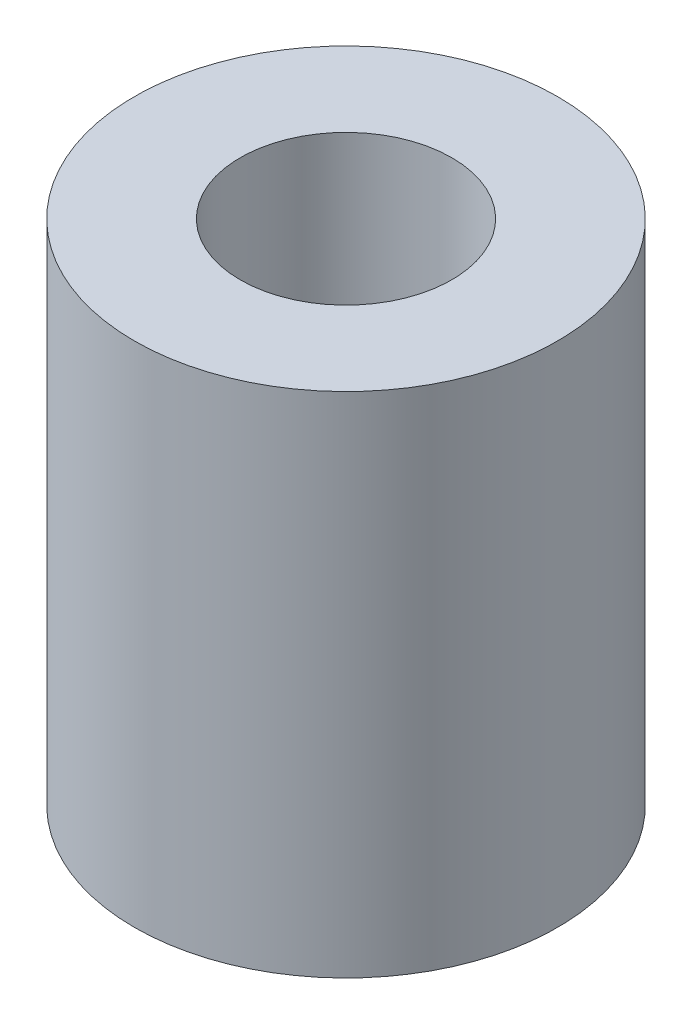
ISO-10303-21;
HEADER;
FILE_DESCRIPTION(('STEP AP214'),'2;1');
FILE_NAME('part.step','',(''),(''),'','','');
FILE_SCHEMA(('AUTOMOTIVE_DESIGN { 1 0 10303 214 1 1 1 1 }'));
ENDSEC;
DATA;
#1=APPLICATION_CONTEXT('core data for automotive mechanical design processes');
#2=APPLICATION_PROTOCOL_DEFINITION('international standard','automotive_design',2000,#1);
#3=PRODUCT_CONTEXT('',#1,'mechanical');
#4=PRODUCT('Part','Part','',(#3));
#5=PRODUCT_RELATED_PRODUCT_CATEGORY('part','',(#4));
#6=PRODUCT_DEFINITION_FORMATION('','',#4);
#7=PRODUCT_DEFINITION_CONTEXT('part definition',#1,'design');
#8=PRODUCT_DEFINITION('design','',#6,#7);
#9=PRODUCT_DEFINITION_SHAPE('','',#8);
#10=(LENGTH_UNIT() NAMED_UNIT(*) SI_UNIT(.MILLI.,.METRE.));
#11=(NAMED_UNIT(*) PLANE_ANGLE_UNIT() SI_UNIT($,.RADIAN.));
#12=(NAMED_UNIT(*) SI_UNIT($,.STERADIAN.) SOLID_ANGLE_UNIT());
#13=UNCERTAINTY_MEASURE_WITH_UNIT(LENGTH_MEASURE(1.E-05),#10,'distance_accuracy_value','');
#14=(GEOMETRIC_REPRESENTATION_CONTEXT(3) GLOBAL_UNCERTAINTY_ASSIGNED_CONTEXT((#13)) GLOBAL_UNIT_ASSIGNED_CONTEXT((#10,
#11,#12)) REPRESENTATION_CONTEXT('',''));
#15=CARTESIAN_POINT('',(0.,0.,0.));
#16=DIRECTION('',(0.,0.,1.));
#17=DIRECTION('',(1.,0.,0.));
#18=AXIS2_PLACEMENT_3D('',#15,#16,#17);
#19=CARTESIAN_POINT('',(0.,6.,0.));
#20=DIRECTION('',(0.,-1.,0.));
#21=DIRECTION('',(0.,0.,-1.));
#22=AXIS2_PLACEMENT_3D('',#19,#20,#21);
#23=CYLINDRICAL_SURFACE('',#22,2.5);
#24=CARTESIAN_POINT('',(0.,6.,0.));
#25=DIRECTION('',(0.,1.,0.));
#26=DIRECTION('',(0.,0.,1.));
#27=AXIS2_PLACEMENT_3D('',#24,#25,#26);
#28=CIRCLE('',#27,2.5);
#29=CARTESIAN_POINT('',(0.,6.,2.5));
#30=VERTEX_POINT('',#29);
#31=EDGE_CURVE('E10',#30,#30,#28,.T.);
#32=ORIENTED_EDGE('',*,*,#31,.F.);
#33=EDGE_LOOP('',(#32));
#34=FACE_BOUND('',#33,.T.);
#35=CARTESIAN_POINT('',(0.,0.,0.));
#36=DIRECTION('',(0.,1.,0.));
#37=DIRECTION('',(0.,0.,1.));
#38=AXIS2_PLACEMENT_3D('',#35,#36,#37);
#39=CIRCLE('',#38,2.5);
#40=CARTESIAN_POINT('',(0.,0.,2.5));
#41=VERTEX_POINT('',#40);
#42=EDGE_CURVE('E37',#41,#41,#39,.T.);
#43=ORIENTED_EDGE('',*,*,#42,.T.);
#44=EDGE_LOOP('',(#43));
#45=FACE_BOUND('',#44,.T.);
#46=ADVANCED_FACE('F34',(#34,#45),#23,.T.);
#47=CARTESIAN_POINT('',(0.,6.,0.));
#48=DIRECTION('',(0.,1.,0.));
#49=DIRECTION('',(0.,0.,1.));
#50=AXIS2_PLACEMENT_3D('',#47,#48,#49);
#51=PLANE('',#50);
#52=CARTESIAN_POINT('',(0.,6.,0.));
#53=DIRECTION('',(0.,1.,0.));
#54=DIRECTION('',(0.,0.,1.));
#55=AXIS2_PLACEMENT_3D('',#52,#53,#54);
#56=CIRCLE('',#55,1.24999999999999);
#57=CARTESIAN_POINT('',(0.,6.,1.24999999999999));
#58=VERTEX_POINT('',#57);
#59=EDGE_CURVE('E48',#58,#58,#56,.T.);
#60=ORIENTED_EDGE('',*,*,#59,.F.);
#61=EDGE_LOOP('',(#60));
#62=FACE_BOUND('',#61,.T.);
#63=ORIENTED_EDGE('',*,*,#31,.T.);
#64=EDGE_LOOP('',(#63));
#65=FACE_BOUND('',#64,.T.);
#66=ADVANCED_FACE('F54',(#62,#65),#51,.T.);
#67=CARTESIAN_POINT('',(0.,0.,0.));
#68=DIRECTION('',(0.,1.,0.));
#69=DIRECTION('',(0.,0.,1.));
#70=AXIS2_PLACEMENT_3D('',#67,#68,#69);
#71=PLANE('',#70);
#72=CARTESIAN_POINT('',(0.,0.,0.));
#73=DIRECTION('',(0.,1.,0.));
#74=DIRECTION('',(0.,0.,1.));
#75=AXIS2_PLACEMENT_3D('',#72,#73,#74);
#76=CIRCLE('',#75,1.25);
#77=CARTESIAN_POINT('',(0.,0.,1.25));
#78=VERTEX_POINT('',#77);
#79=EDGE_CURVE('E44',#78,#78,#76,.T.);
#80=ORIENTED_EDGE('',*,*,#79,.T.);
#81=EDGE_LOOP('',(#80));
#82=FACE_BOUND('',#81,.T.);
#83=ORIENTED_EDGE('',*,*,#42,.F.);
#84=EDGE_LOOP('',(#83));
#85=FACE_BOUND('',#84,.T.);
#86=ADVANCED_FACE('F56',(#82,#85),#71,.F.);
#87=CARTESIAN_POINT('',(0.,6.,0.));
#88=DIRECTION('',(0.,1.,0.));
#89=DIRECTION('',(0.,0.,1.));
#90=AXIS2_PLACEMENT_3D('',#87,#88,#89);
#91=CYLINDRICAL_SURFACE('',#90,1.24999999999999);
#92=ORIENTED_EDGE('',*,*,#79,.F.);
#93=EDGE_LOOP('',(#92));
#94=FACE_BOUND('',#93,.T.);
#95=ORIENTED_EDGE('',*,*,#59,.T.);
#96=EDGE_LOOP('',(#95));
#97=FACE_BOUND('',#96,.T.);
#98=ADVANCED_FACE('F52',(#94,#97),#91,.F.);
#99=CLOSED_SHELL('',(#46,#66,#86,#98));
#100=MANIFOLD_SOLID_BREP('B2',#99);
#101=ADVANCED_BREP_SHAPE_REPRESENTATION('',(#18,#100),#14);
#102=SHAPE_DEFINITION_REPRESENTATION(#9,#101);
ENDSEC;
END-ISO-10303-21;
